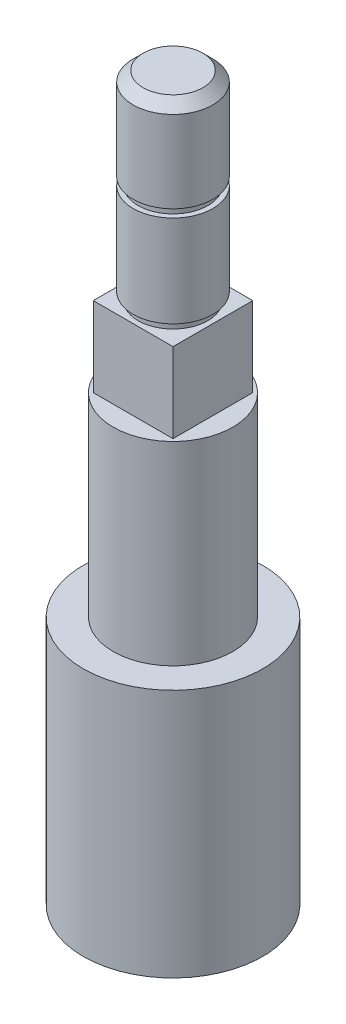
ISO-10303-21;
HEADER;
FILE_DESCRIPTION(('STEP AP214'),'2;1');
FILE_NAME('part.step','',(''),(''),'','','');
FILE_SCHEMA(('AUTOMOTIVE_DESIGN { 1 0 10303 214 1 1 1 1 }'));
ENDSEC;
DATA;
#1=APPLICATION_CONTEXT('core data for automotive mechanical design processes');
#2=APPLICATION_PROTOCOL_DEFINITION('international standard','automotive_design',2000,#1);
#3=PRODUCT_CONTEXT('',#1,'mechanical');
#4=PRODUCT('Part','Part','',(#3));
#5=PRODUCT_RELATED_PRODUCT_CATEGORY('part','',(#4));
#6=PRODUCT_DEFINITION_FORMATION('','',#4);
#7=PRODUCT_DEFINITION_CONTEXT('part definition',#1,'design');
#8=PRODUCT_DEFINITION('design','',#6,#7);
#9=PRODUCT_DEFINITION_SHAPE('','',#8);
#10=(LENGTH_UNIT() NAMED_UNIT(*) SI_UNIT(.MILLI.,.METRE.));
#11=(NAMED_UNIT(*) PLANE_ANGLE_UNIT() SI_UNIT($,.RADIAN.));
#12=(NAMED_UNIT(*) SI_UNIT($,.STERADIAN.) SOLID_ANGLE_UNIT());
#13=UNCERTAINTY_MEASURE_WITH_UNIT(LENGTH_MEASURE(1.E-05),#10,'distance_accuracy_value','');
#14=(GEOMETRIC_REPRESENTATION_CONTEXT(3) GLOBAL_UNCERTAINTY_ASSIGNED_CONTEXT((#13)) GLOBAL_UNIT_ASSIGNED_CONTEXT((#10,
#11,#12)) REPRESENTATION_CONTEXT('',''));
#15=CARTESIAN_POINT('',(0.,0.,0.));
#16=DIRECTION('',(0.,0.,1.));
#17=DIRECTION('',(1.,0.,0.));
#18=AXIS2_PLACEMENT_3D('',#15,#16,#17);
#19=CARTESIAN_POINT('',(0.,25.,0.));
#20=DIRECTION('',(0.,-1.,0.));
#21=DIRECTION('',(0.,0.,-1.));
#22=AXIS2_PLACEMENT_3D('',#19,#20,#21);
#23=CYLINDRICAL_SURFACE('',#22,9.);
#24=CARTESIAN_POINT('',(-9.,8.5,0.));
#25=CARTESIAN_POINT('',(-8.99999856701294,8.50000335336869,-0.0836345429749289));
#26=CARTESIAN_POINT('',(-8.9988220674782,8.50701836498135,-0.167314729103293));
#27=CARTESIAN_POINT('',(-8.99424206964832,8.53488139525919,-0.332328133003826));
#28=CARTESIAN_POINT('',(-8.99083652354334,8.55574213414696,-0.413659120775548));
#29=CARTESIAN_POINT('',(-8.9821804094187,8.61064926915565,-0.571562848327586));
#30=CARTESIAN_POINT('',(-8.97693135095516,8.64468487938434,-0.64813942105914));
#31=CARTESIAN_POINT('',(-8.96516536249242,8.72494737523144,-0.794485105186767));
#32=CARTESIAN_POINT('',(-8.9586485775266,8.7711728664898,-0.864254993927155));
#33=CARTESIAN_POINT('',(-8.94499990474988,8.87497305029228,-0.995683568575008));
#34=CARTESIAN_POINT('',(-8.93786323088914,8.93264146878168,-1.05726774212098));
#35=CARTESIAN_POINT('',(-8.92381576126039,9.05748878108369,-1.16993309919596));
#36=CARTESIAN_POINT('',(-8.916904979776,9.12466827487397,-1.22101361963458));
#37=CARTESIAN_POINT('',(-8.90404539455868,9.26714257971823,-1.31152027536308));
#38=CARTESIAN_POINT('',(-8.89810277454982,9.34248480208285,-1.3508727317166));
#39=CARTESIAN_POINT('',(-8.88791873876805,9.49882573858037,-1.41633501924673));
#40=CARTESIAN_POINT('',(-8.88367720808584,9.57982407020658,-1.44244574493937));
#41=CARTESIAN_POINT('',(-8.87742322105653,9.74438816491392,-1.48044862667088));
#42=CARTESIAN_POINT('',(-8.8753906109142,9.82792344190083,-1.49246941748124));
#43=CARTESIAN_POINT('',(-8.87372363361989,9.99584816613008,-1.50235003517393));
#44=CARTESIAN_POINT('',(-8.87408909674328,10.0802375525004,-1.5002108642334));
#45=CARTESIAN_POINT('',(-8.87715857318133,10.2465567167653,-1.48193705903769));
#46=CARTESIAN_POINT('',(-8.8798384399135,10.3285028821271,-1.46594692913386));
#47=CARTESIAN_POINT('',(-8.88719697126605,10.4885327906975,-1.42065188424207));
#48=CARTESIAN_POINT('',(-8.89187570443963,10.5666164013331,-1.39134651259184));
#49=CARTESIAN_POINT('',(-8.9027308760046,10.7171372940646,-1.32010634765635));
#50=CARTESIAN_POINT('',(-8.90891440264395,10.7895456436487,-1.27811154832783));
#51=CARTESIAN_POINT('',(-8.92207751049005,10.926342640323,-1.18272721053446));
#52=CARTESIAN_POINT('',(-8.92905715592572,10.990730639473,-1.12933675239257));
#53=CARTESIAN_POINT('',(-8.94313216727871,11.1104956514844,-1.01188932729543));
#54=CARTESIAN_POINT('',(-8.95022789538991,11.165751111124,-0.947708378323877));
#55=CARTESIAN_POINT('',(-8.96365560838034,11.2647266575992,-0.810921149388988));
#56=CARTESIAN_POINT('',(-8.96998758833847,11.3084466701099,-0.738314815143853));
#57=CARTESIAN_POINT('',(-8.98118335735747,11.3831213362818,-0.586623549700027));
#58=CARTESIAN_POINT('',(-8.98604591044468,11.4140652515988,-0.507533235338797));
#59=CARTESIAN_POINT('',(-8.99374501807596,11.4621965291476,-0.345179007361639));
#60=CARTESIAN_POINT('',(-8.99658174210284,11.4793850421842,-0.261915443507681));
#61=CARTESIAN_POINT('',(-8.99988677905612,11.4993528150767,-0.0946259407809745));
#62=CARTESIAN_POINT('',(-9.00038251807671,11.5022989430834,-0.0106204422906072));
#63=CARTESIAN_POINT('',(-8.99902484652702,11.4941431933431,0.156683863733932));
#64=CARTESIAN_POINT('',(-8.99717152634471,11.4830418561198,0.239982698335222));
#65=CARTESIAN_POINT('',(-8.99134096162921,11.4472450903987,0.402993705328057));
#66=CARTESIAN_POINT('',(-8.98737662880786,11.4226322749659,0.482724521031227));
#67=CARTESIAN_POINT('',(-8.97776678673215,11.3605992890803,0.636928130916264));
#68=CARTESIAN_POINT('',(-8.97212118307212,11.3231783994188,0.71140062954583));
#69=CARTESIAN_POINT('',(-8.95970709781445,11.2362093251819,0.853698413681374));
#70=CARTESIAN_POINT('',(-8.95292913532213,11.1865569062996,0.921459150562288));
#71=CARTESIAN_POINT('',(-8.9390308043514,11.076677610769,1.04774615130161));
#72=CARTESIAN_POINT('',(-8.93191041102928,11.016449966034,1.10627174381795));
#73=CARTESIAN_POINT('',(-8.91804105141507,10.8863814711571,1.2130456677948));
#74=CARTESIAN_POINT('',(-8.91129669682264,10.8164475006914,1.26118125666823));
#75=CARTESIAN_POINT('',(-8.8990291786673,10.6693882185169,1.34502138617699));
#76=CARTESIAN_POINT('',(-8.89350597639612,10.5922631348635,1.38072632086189));
#77=CARTESIAN_POINT('',(-8.88434072218623,10.4333261603127,1.43852299888389));
#78=CARTESIAN_POINT('',(-8.88069092586639,10.3515351429817,1.46067085952877));
#79=CARTESIAN_POINT('',(-8.87566630101156,10.1853279224669,1.49090127226697));
#80=CARTESIAN_POINT('',(-8.87429127469633,10.1009119481608,1.4989850471677));
#81=CARTESIAN_POINT('',(-8.87398039850407,9.93297690042256,1.50082371962841));
#82=CARTESIAN_POINT('',(-8.8750143390339,9.84945977285483,1.49475608167511));
#83=CARTESIAN_POINT('',(-8.87933868872237,9.68465245116954,1.46884790337411));
#84=CARTESIAN_POINT('',(-8.88262909056728,9.60336224983488,1.44900740766749));
#85=CARTESIAN_POINT('',(-8.89108413769031,9.44538493762443,1.39618469375694));
#86=CARTESIAN_POINT('',(-8.89624660331802,9.36869259396639,1.36321775436027));
#87=CARTESIAN_POINT('',(-8.90786621353324,9.22189859848309,1.28509620234955));
#88=CARTESIAN_POINT('',(-8.91432342233039,9.15179727377672,1.23994098524914));
#89=CARTESIAN_POINT('',(-8.92790072427373,9.01927865013535,1.13809133062329));
#90=CARTESIAN_POINT('',(-8.93502777345781,8.95696238997984,1.08126633815619));
#91=CARTESIAN_POINT('',(-8.94908623416505,8.84268903731504,0.95796541882814));
#92=CARTESIAN_POINT('',(-8.95601760015928,8.7907343388171,0.891487267747583));
#93=CARTESIAN_POINT('',(-8.96895917785332,8.69833103908003,0.750221501784171));
#94=CARTESIAN_POINT('',(-8.97496269751862,8.65796437641223,0.675379672519693));
#95=CARTESIAN_POINT('',(-8.98530700561065,8.59043830923405,0.519907841627391));
#96=CARTESIAN_POINT('',(-8.98964944906489,8.56326575135218,0.439283696898007));
#97=CARTESIAN_POINT('',(-8.99523474499773,8.528796835524,0.298621986027241));
#98=CARTESIAN_POINT('',(-8.99701216364015,8.51801531823042,0.239435298179069));
#99=CARTESIAN_POINT('',(-8.99939529591672,8.50361575729315,0.120173586191886));
#100=CARTESIAN_POINT('',(-9.00000102972385,8.49999759031758,0.0600985773650968));
#101=CARTESIAN_POINT('',(-9.,8.5,0.));
#102=B_SPLINE_CURVE_WITH_KNOTS('',3,(#24,#25,#26,#27,#28,#29,#30,#31,#32,#33,#34,#35,#36,#37,
#38,#39,#40,#41,#42,#43,#44,#45,#46,#47,#48,#49,#50,#51,#52,#53,#54,#55,#56,#57,#58,#59,#60,#61,
#62,#63,#64,#65,#66,#67,#68,#69,#70,#71,#72,#73,#74,#75,#76,#77,#78,#79,#80,#81,#82,#83,#84,#85,
#86,#87,#88,#89,#90,#91,#92,#93,#94,#95,#96,#97,#98,#99,#100,#101),.UNSPECIFIED.,.T.,.F.,(4,2,2,
2,2,2,2,2,2,2,2,2,2,2,2,2,2,2,2,2,2,2,2,2,2,2,2,2,2,2,2,2,2,2,2,2,2,2,4),(0.,0.250683950963106,
0.501598527417252,0.752308120215162,1.00298904760487,1.25581494637399,1.50865680101914,
1.76305512494304,2.01743626125709,2.26947646262054,2.52149882592532,2.77092313056245,
3.02035599015229,3.27098733979534,3.52163892408344,3.77539661946796,4.02915594981509,
4.28312813349542,4.53707906712689,4.78804730094838,5.03900587821516,5.28844684203849,
5.5379018149564,5.78956095376214,6.0412383783257,6.29552293204572,6.54979942425566,
6.80301613405063,7.05621082671971,7.3062474571362,7.5562832771288,7.80602890935733,
8.05578693017602,8.30850830516035,8.56128800327383,8.81581338964319,9.07008451278043,
9.25022548898411,9.4303633636618),.UNSPECIFIED.);
#103=CARTESIAN_POINT('',(-9.,8.5,0.));
#104=VERTEX_POINT('',#103);
#105=EDGE_CURVE('E129',#104,#104,#102,.T.);
#106=ORIENTED_EDGE('',*,*,#105,.T.);
#107=EDGE_LOOP('',(#106));
#108=FACE_BOUND('',#107,.T.);
#109=CARTESIAN_POINT('',(0.,25.,0.));
#110=DIRECTION('',(0.,1.,0.));
#111=DIRECTION('',(0.,0.,1.));
#112=AXIS2_PLACEMENT_3D('',#109,#110,#111);
#113=CIRCLE('',#112,9.);
#114=CARTESIAN_POINT('',(0.,25.,9.));
#115=VERTEX_POINT('',#114);
#116=EDGE_CURVE('E111',#115,#115,#113,.T.);
#117=ORIENTED_EDGE('',*,*,#116,.F.);
#118=EDGE_LOOP('',(#117));
#119=FACE_BOUND('',#118,.T.);
#120=CARTESIAN_POINT('',(0.,0.,0.));
#121=DIRECTION('',(0.,1.,0.));
#122=DIRECTION('',(0.,0.,1.));
#123=AXIS2_PLACEMENT_3D('',#120,#121,#122);
#124=CIRCLE('',#123,9.);
#125=CARTESIAN_POINT('',(0.,0.,9.));
#126=VERTEX_POINT('',#125);
#127=EDGE_CURVE('E115',#126,#126,#124,.T.);
#128=ORIENTED_EDGE('',*,*,#127,.T.);
#129=EDGE_LOOP('',(#128));
#130=FACE_BOUND('',#129,.T.);
#131=ADVANCED_FACE('F36',(#108,#119,#130),#23,.T.);
#132=CARTESIAN_POINT('',(0.,25.,0.));
#133=DIRECTION('',(0.,1.,0.));
#134=DIRECTION('',(0.,0.,1.));
#135=AXIS2_PLACEMENT_3D('',#132,#133,#134);
#136=PLANE('',#135);
#137=CARTESIAN_POINT('',(0.,25.,0.));
#138=DIRECTION('',(0.,1.,0.));
#139=DIRECTION('',(0.,0.,1.));
#140=AXIS2_PLACEMENT_3D('',#137,#138,#139);
#141=CIRCLE('',#140,6.);
#142=CARTESIAN_POINT('',(0.,25.,6.));
#143=VERTEX_POINT('',#142);
#144=EDGE_CURVE('E108',#143,#143,#141,.T.);
#145=ORIENTED_EDGE('',*,*,#144,.F.);
#146=EDGE_LOOP('',(#145));
#147=FACE_BOUND('',#146,.T.);
#148=ORIENTED_EDGE('',*,*,#116,.T.);
#149=EDGE_LOOP('',(#148));
#150=FACE_BOUND('',#149,.T.);
#151=ADVANCED_FACE('F157',(#147,#150),#136,.T.);
#152=CARTESIAN_POINT('',(0.,0.,0.));
#153=DIRECTION('',(0.,1.,0.));
#154=DIRECTION('',(0.,0.,1.));
#155=AXIS2_PLACEMENT_3D('',#152,#153,#154);
#156=PLANE('',#155);
#157=CARTESIAN_POINT('',(0.,0.,0.));
#158=DIRECTION('',(0.,-1.,0.));
#159=DIRECTION('',(0.,0.,-1.));
#160=AXIS2_PLACEMENT_3D('',#157,#158,#159);
#161=CIRCLE('',#160,4.);
#162=CARTESIAN_POINT('',(0.,0.,-4.));
#163=VERTEX_POINT('',#162);
#164=EDGE_CURVE('E102',#163,#163,#161,.T.);
#165=ORIENTED_EDGE('',*,*,#164,.F.);
#166=EDGE_LOOP('',(#165));
#167=FACE_BOUND('',#166,.T.);
#168=ORIENTED_EDGE('',*,*,#127,.F.);
#169=EDGE_LOOP('',(#168));
#170=FACE_BOUND('',#169,.T.);
#171=ADVANCED_FACE('F159',(#167,#170),#156,.F.);
#172=CARTESIAN_POINT('',(0.,20.,0.));
#173=DIRECTION('',(0.,-1.,0.));
#174=DIRECTION('',(0.,0.,-1.));
#175=AXIS2_PLACEMENT_3D('',#172,#173,#174);
#176=CYLINDRICAL_SURFACE('',#175,4.);
#177=CARTESIAN_POINT('',(-3.70809924354783,10.,-1.5));
#178=CARTESIAN_POINT('',(-3.70809640633806,9.91899251627921,-1.50000304106109));
#179=CARTESIAN_POINT('',(-3.71078260240986,9.83800507749637,-1.49341597549487));
#180=CARTESIAN_POINT('',(-3.72116159304967,9.6784719170868,-1.46736187895468));
#181=CARTESIAN_POINT('',(-3.72885423767112,9.59992612240499,-1.44789523373263));
#182=CARTESIAN_POINT('',(-3.748254802809,9.44762462838647,-1.39689657610574));
#183=CARTESIAN_POINT('',(-3.7599530956926,9.37385794334892,-1.36539347266348));
#184=CARTESIAN_POINT('',(-3.78603134206598,9.23262810318116,-1.29131856742698));
#185=CARTESIAN_POINT('',(-3.80041210067323,9.16516684971748,-1.24874344095039));
#186=CARTESIAN_POINT('',(-3.83103574665713,9.03510968837718,-1.15146661374162));
#187=CARTESIAN_POINT('',(-3.84733341923603,8.97287147037061,-1.09630381213306));
#188=CARTESIAN_POINT('',(-3.87949750628547,8.85827718532851,-0.976395839778927));
#189=CARTESIAN_POINT('',(-3.89536382814785,8.80592322625815,-0.91164863025668));
#190=CARTESIAN_POINT('',(-3.92552873936553,8.71086048770439,-0.7716946551776));
#191=CARTESIAN_POINT('',(-3.93975561223505,8.66854052528414,-0.696206947538028));
#192=CARTESIAN_POINT('',(-3.96438007973848,8.59734882747509,-0.538555771965248));
#193=CARTESIAN_POINT('',(-3.97477900217006,8.56847242800803,-0.456394630933536));
#194=CARTESIAN_POINT('',(-3.9901869710344,8.52624210422538,-0.291489341676832));
#195=CARTESIAN_POINT('',(-3.99540915214774,8.51227237255954,-0.208923197281597));
#196=CARTESIAN_POINT('',(-4.0006401410794,8.49827879905501,-0.0424643637947862));
#197=CARTESIAN_POINT('',(-4.00065064414902,8.49825042238129,0.0414278850628328));
#198=CARTESIAN_POINT('',(-3.99559265903894,8.51178176146517,0.203743543064476));
#199=CARTESIAN_POINT('',(-3.99077541996683,8.52466929794882,0.2822321782669));
#200=CARTESIAN_POINT('',(-3.97693274932263,8.56253591522555,0.435839217984392));
#201=CARTESIAN_POINT('',(-3.96790701975578,8.58751585226204,0.510957383430299));
#202=CARTESIAN_POINT('',(-3.94637769167531,8.64917045167585,0.656989017303104));
#203=CARTESIAN_POINT('',(-3.93382539470077,8.68601000526841,0.727825392287309));
#204=CARTESIAN_POINT('',(-3.90651310225279,8.77019209692939,0.862486607957559));
#205=CARTESIAN_POINT('',(-3.8917523951284,8.8175380230176,0.926309176932323));
#206=CARTESIAN_POINT('',(-3.86052529655816,8.92462728628318,1.04909048680094));
#207=CARTESIAN_POINT('',(-3.84400963763883,8.98493391565043,1.10754614526348));
#208=CARTESIAN_POINT('',(-3.81182460645722,9.11459299332156,1.21370395569342));
#209=CARTESIAN_POINT('',(-3.79615544748847,9.18394770658664,1.261403406929));
#210=CARTESIAN_POINT('',(-3.76712703500335,9.33171946746282,1.34565611808152));
#211=CARTESIAN_POINT('',(-3.75382677150277,9.41030349368607,1.38193847851831));
#212=CARTESIAN_POINT('',(-3.73172438629002,9.57309622516757,1.44056464441501));
#213=CARTESIAN_POINT('',(-3.72291976205783,9.65730177159369,1.46291620605595));
#214=CARTESIAN_POINT('',(-3.71139597222848,9.82397596231595,1.49190191709668));
#215=CARTESIAN_POINT('',(-3.70836785241537,9.90628410553614,1.49933521158966));
#216=CARTESIAN_POINT('',(-3.70786539525016,10.0710093567417,1.50057885636272));
#217=CARTESIAN_POINT('',(-3.71038967003987,10.1534264323525,1.49439261093762));
#218=CARTESIAN_POINT('',(-3.72039381629735,10.3119299222877,1.46929733520157));
#219=CARTESIAN_POINT('',(-3.72763276216449,10.3881311357647,1.45100618334225));
#220=CARTESIAN_POINT('',(-3.74596487046361,10.5363479447202,1.40299774640638));
#221=CARTESIAN_POINT('',(-3.75705882250173,10.6083626791681,1.37327812034623));
#222=CARTESIAN_POINT('',(-3.7823624311608,10.7491644380762,1.30200292275278));
#223=CARTESIAN_POINT('',(-3.79667328892065,10.8177292921373,1.26004545177047));
#224=CARTESIAN_POINT('',(-3.82662814294291,10.947128981726,1.16591317862479));
#225=CARTESIAN_POINT('',(-3.84227262594077,11.0079609746246,1.11373463696435));
#226=CARTESIAN_POINT('',(-3.87433046553184,11.1241683731951,0.996727340900938));
#227=CARTESIAN_POINT('',(-3.89072969357028,11.1789534087688,0.931306341491061));
#228=CARTESIAN_POINT('',(-3.92149874963302,11.2768383675894,0.79179747175315));
#229=CARTESIAN_POINT('',(-3.93586857107664,11.3199382529458,0.717709573322673));
#230=CARTESIAN_POINT('',(-3.96094985704552,11.3929460561996,0.563016329468477));
#231=CARTESIAN_POINT('',(-3.9716738133801,11.4228991237926,0.482434433064627));
#232=CARTESIAN_POINT('',(-3.98829436712571,11.4686564138499,0.316881887523255));
#233=CARTESIAN_POINT('',(-3.99419323299412,11.4844672854224,0.231913320723593));
#234=CARTESIAN_POINT('',(-4.00028407317073,11.5007744027548,0.0653355852738158));
#235=CARTESIAN_POINT('',(-4.00078860953764,11.502109483059,-0.0161807680608449));
#236=CARTESIAN_POINT('',(-3.99684889809224,11.4915848405546,-0.178226786412423));
#237=CARTESIAN_POINT('',(-3.9924052471313,11.4797267091141,-0.258756569245257));
#238=CARTESIAN_POINT('',(-3.97921089603771,11.4437411485064,-0.414548248377126));
#239=CARTESIAN_POINT('',(-3.97056791378017,11.4199200941216,-0.489890731068835));
#240=CARTESIAN_POINT('',(-3.9498778362099,11.3609899866156,-0.635515473006391));
#241=CARTESIAN_POINT('',(-3.93783009655664,11.3258787966952,-0.705796771275543));
#242=CARTESIAN_POINT('',(-3.91090618300074,11.2436860564952,-0.842540176994413));
#243=CARTESIAN_POINT('',(-3.89593240108828,11.1961633594859,-0.90871754884685));
#244=CARTESIAN_POINT('',(-3.86499507694844,11.0911921698124,-1.03241734752336));
#245=CARTESIAN_POINT('',(-3.84903118274027,11.0337401341921,-1.0899366712559));
#246=CARTESIAN_POINT('',(-3.81688129739175,10.9069358683549,-1.19781214236196));
#247=CARTESIAN_POINT('',(-3.8007280534916,10.8371155978457,-1.24762999816025));
#248=CARTESIAN_POINT('',(-3.77098325003638,10.6895841304267,-1.33484709556843));
#249=CARTESIAN_POINT('',(-3.75739195631216,10.6118721159465,-1.37224504878157));
#250=CARTESIAN_POINT('',(-3.73402269853266,10.4470443190246,-1.4346588697426));
#251=CARTESIAN_POINT('',(-3.7244380329086,10.3596656334882,-1.45906002899523));
#252=CARTESIAN_POINT('',(-3.71147994336315,10.1815147280442,-1.49172356722079));
#253=CARTESIAN_POINT('',(-3.70810242179736,10.09074478729,-1.49999659339571));
#254=CARTESIAN_POINT('',(-3.70809924354783,10.,-1.5));
#255=B_SPLINE_CURVE_WITH_KNOTS('',3,(#177,#178,#179,#180,#181,#182,#183,#184,#185,#186,#187,
#188,#189,#190,#191,#192,#193,#194,#195,#196,#197,#198,#199,#200,#201,#202,#203,#204,#205,#206,
#207,#208,#209,#210,#211,#212,#213,#214,#215,#216,#217,#218,#219,#220,#221,#222,#223,#224,#225,
#226,#227,#228,#229,#230,#231,#232,#233,#234,#235,#236,#237,#238,#239,#240,#241,#242,#243,#244,
#245,#246,#247,#248,#249,#250,#251,#252,#253,#254),.UNSPECIFIED.,.T.,.F.,(4,2,2,2,2,2,2,2,2,2,2,
2,2,2,2,2,2,2,2,2,2,2,2,2,2,2,2,2,2,2,2,2,2,2,2,2,2,2,4),(0.,0.242684541416169,
0.485361814598854,0.72745985675703,0.969630679682932,1.22274652401128,1.47591628822983,
1.73770072136421,1.9993942638133,2.24980018489679,2.50012465404857,2.73806472803194,
2.97602165263335,3.21744131210668,3.45893893628976,3.71456675065874,3.97025867827335,
4.23162592252967,4.49284751635474,4.73965657740485,4.98640395388884,5.22143845928198,
5.45652113429526,5.70041561005821,5.94439948466355,6.20385016993624,6.46330169650178,
6.72185508890168,6.98028685560127,7.22365720549936,7.4669982031948,7.7044027400389,
7.94185223512831,8.18928323676987,8.43680270894965,8.69738599542079,8.95799630544242,
9.23003178870927,9.50188762323053),.UNSPECIFIED.);
#256=CARTESIAN_POINT('',(-3.70809924354783,10.,-1.5));
#257=VERTEX_POINT('',#256);
#258=EDGE_CURVE('E122',#257,#257,#255,.T.);
#259=ORIENTED_EDGE('',*,*,#258,.T.);
#260=EDGE_LOOP('',(#259));
#261=FACE_BOUND('',#260,.T.);
#262=CARTESIAN_POINT('',(0.,20.,0.));
#263=DIRECTION('',(0.,-1.,0.));
#264=DIRECTION('',(0.,0.,-1.));
#265=AXIS2_PLACEMENT_3D('',#262,#263,#264);
#266=CIRCLE('',#265,4.);
#267=CARTESIAN_POINT('',(0.,20.,-4.));
#268=VERTEX_POINT('',#267);
#269=EDGE_CURVE('E112',#268,#268,#266,.T.);
#270=ORIENTED_EDGE('',*,*,#269,.F.);
#271=EDGE_LOOP('',(#270));
#272=FACE_BOUND('',#271,.T.);
#273=ORIENTED_EDGE('',*,*,#164,.T.);
#274=EDGE_LOOP('',(#273));
#275=FACE_BOUND('',#274,.T.);
#276=ADVANCED_FACE('F131',(#261,#272,#275),#176,.F.);
#277=CARTESIAN_POINT('',(0.,20.,0.));
#278=DIRECTION('',(0.,-1.,0.));
#279=DIRECTION('',(0.,0.,-1.));
#280=AXIS2_PLACEMENT_3D('',#277,#278,#279);
#281=PLANE('',#280);
#282=ORIENTED_EDGE('',*,*,#269,.T.);
#283=EDGE_LOOP('',(#282));
#284=FACE_BOUND('',#283,.T.);
#285=ADVANCED_FACE('F177',(#284),#281,.T.);
#286=CARTESIAN_POINT('',(0.,44.5,0.));
#287=DIRECTION('',(0.,-1.,0.));
#288=DIRECTION('',(0.,0.,-1.));
#289=AXIS2_PLACEMENT_3D('',#286,#287,#288);
#290=CYLINDRICAL_SURFACE('',#289,6.);
#291=CARTESIAN_POINT('',(0.,44.5,0.));
#292=DIRECTION('',(0.,1.,0.));
#293=DIRECTION('',(0.,0.,1.));
#294=AXIS2_PLACEMENT_3D('',#291,#292,#293);
#295=CIRCLE('',#294,6.);
#296=CARTESIAN_POINT('',(0.,44.5,6.));
#297=VERTEX_POINT('',#296);
#298=EDGE_CURVE('E99',#297,#297,#295,.T.);
#299=ORIENTED_EDGE('',*,*,#298,.F.);
#300=EDGE_LOOP('',(#299));
#301=FACE_BOUND('',#300,.T.);
#302=ORIENTED_EDGE('',*,*,#144,.T.);
#303=EDGE_LOOP('',(#302));
#304=FACE_BOUND('',#303,.T.);
#305=ADVANCED_FACE('F174',(#301,#304),#290,.T.);
#306=CARTESIAN_POINT('',(0.,44.5,0.));
#307=DIRECTION('',(0.,1.,0.));
#308=DIRECTION('',(0.,0.,1.));
#309=AXIS2_PLACEMENT_3D('',#306,#307,#308);
#310=PLANE('',#309);
#311=DIRECTION('',(0.,0.,1.));
#312=VECTOR('',#311,1.);
#313=CARTESIAN_POINT('',(-4.,44.5,-4.));
#314=LINE('',#313,#312);
#315=CARTESIAN_POINT('',(-4.,44.5,-4.));
#316=VERTEX_POINT('',#315);
#317=CARTESIAN_POINT('',(-4.,44.5,4.));
#318=VERTEX_POINT('',#317);
#319=EDGE_CURVE('E52',#316,#318,#314,.T.);
#320=ORIENTED_EDGE('',*,*,#319,.F.);
#321=DIRECTION('',(-1.,0.,0.));
#322=VECTOR('',#321,1.);
#323=CARTESIAN_POINT('',(-4.,44.5,-4.));
#324=LINE('',#323,#322);
#325=CARTESIAN_POINT('',(4.,44.5,-4.));
#326=VERTEX_POINT('',#325);
#327=EDGE_CURVE('E56',#326,#316,#324,.T.);
#328=ORIENTED_EDGE('',*,*,#327,.F.);
#329=DIRECTION('',(0.,0.,-1.));
#330=VECTOR('',#329,1.);
#331=CARTESIAN_POINT('',(4.,44.5,-4.));
#332=LINE('',#331,#330);
#333=CARTESIAN_POINT('',(4.,44.5,4.));
#334=VERTEX_POINT('',#333);
#335=EDGE_CURVE('E406',#334,#326,#332,.T.);
#336=ORIENTED_EDGE('',*,*,#335,.F.);
#337=DIRECTION('',(1.,0.,0.));
#338=VECTOR('',#337,1.);
#339=CARTESIAN_POINT('',(-4.,44.5,4.));
#340=LINE('',#339,#338);
#341=EDGE_CURVE('E412',#318,#334,#340,.T.);
#342=ORIENTED_EDGE('',*,*,#341,.F.);
#343=EDGE_LOOP('',(#320,#328,#336,#342));
#344=FACE_BOUND('',#343,.T.);
#345=ORIENTED_EDGE('',*,*,#298,.T.);
#346=EDGE_LOOP('',(#345));
#347=FACE_BOUND('',#346,.T.);
#348=ADVANCED_FACE('F176',(#344,#347),#310,.T.);
#349=CARTESIAN_POINT('',(-4.,52.5,-4.));
#350=DIRECTION('',(1.,0.,0.));
#351=DIRECTION('',(0.,0.,-1.));
#352=AXIS2_PLACEMENT_3D('',#349,#350,#351);
#353=PLANE('',#352);
#354=ORIENTED_EDGE('',*,*,#319,.T.);
#355=DIRECTION('',(0.,-1.,0.));
#356=VECTOR('',#355,1.);
#357=CARTESIAN_POINT('',(-4.,52.5,4.));
#358=LINE('',#357,#356);
#359=CARTESIAN_POINT('',(-4.,52.5,4.));
#360=VERTEX_POINT('',#359);
#361=EDGE_CURVE('E92',#360,#318,#358,.T.);
#362=ORIENTED_EDGE('',*,*,#361,.F.);
#363=DIRECTION('',(0.,0.,1.));
#364=VECTOR('',#363,1.);
#365=CARTESIAN_POINT('',(-4.,52.5,-4.));
#366=LINE('',#365,#364);
#367=CARTESIAN_POINT('',(-4.,52.5,-4.));
#368=VERTEX_POINT('',#367);
#369=EDGE_CURVE('E75',#368,#360,#366,.T.);
#370=ORIENTED_EDGE('',*,*,#369,.F.);
#371=DIRECTION('',(0.,-1.,0.));
#372=VECTOR('',#371,1.);
#373=CARTESIAN_POINT('',(-4.,52.5,-4.));
#374=LINE('',#373,#372);
#375=EDGE_CURVE('E404',#368,#316,#374,.T.);
#376=ORIENTED_EDGE('',*,*,#375,.T.);
#377=EDGE_LOOP('',(#354,#362,#370,#376));
#378=FACE_BOUND('',#377,.T.);
#379=ADVANCED_FACE('F98',(#378),#353,.F.);
#380=CARTESIAN_POINT('',(-4.,52.5,4.));
#381=DIRECTION('',(0.,0.,-1.));
#382=DIRECTION('',(-1.,0.,0.));
#383=AXIS2_PLACEMENT_3D('',#380,#381,#382);
#384=PLANE('',#383);
#385=ORIENTED_EDGE('',*,*,#341,.T.);
#386=DIRECTION('',(0.,-1.,0.));
#387=VECTOR('',#386,1.);
#388=CARTESIAN_POINT('',(4.,52.5,4.));
#389=LINE('',#388,#387);
#390=CARTESIAN_POINT('',(4.,52.5,4.));
#391=VERTEX_POINT('',#390);
#392=EDGE_CURVE('E94',#391,#334,#389,.T.);
#393=ORIENTED_EDGE('',*,*,#392,.F.);
#394=DIRECTION('',(1.,0.,0.));
#395=VECTOR('',#394,1.);
#396=CARTESIAN_POINT('',(-4.,52.5,4.));
#397=LINE('',#396,#395);
#398=EDGE_CURVE('E79',#360,#391,#397,.T.);
#399=ORIENTED_EDGE('',*,*,#398,.F.);
#400=ORIENTED_EDGE('',*,*,#361,.T.);
#401=EDGE_LOOP('',(#385,#393,#399,#400));
#402=FACE_BOUND('',#401,.T.);
#403=ADVANCED_FACE('F91',(#402),#384,.F.);
#404=CARTESIAN_POINT('',(4.,52.5,-4.));
#405=DIRECTION('',(-1.,0.,0.));
#406=DIRECTION('',(0.,0.,1.));
#407=AXIS2_PLACEMENT_3D('',#404,#405,#406);
#408=PLANE('',#407);
#409=ORIENTED_EDGE('',*,*,#335,.T.);
#410=DIRECTION('',(0.,-1.,0.));
#411=VECTOR('',#410,1.);
#412=CARTESIAN_POINT('',(4.,52.5,-4.));
#413=LINE('',#412,#411);
#414=CARTESIAN_POINT('',(4.,52.5,-4.));
#415=VERTEX_POINT('',#414);
#416=EDGE_CURVE('E104',#415,#326,#413,.T.);
#417=ORIENTED_EDGE('',*,*,#416,.F.);
#418=DIRECTION('',(0.,0.,-1.));
#419=VECTOR('',#418,1.);
#420=CARTESIAN_POINT('',(4.,52.5,-4.));
#421=LINE('',#420,#419);
#422=EDGE_CURVE('E96',#391,#415,#421,.T.);
#423=ORIENTED_EDGE('',*,*,#422,.F.);
#424=ORIENTED_EDGE('',*,*,#392,.T.);
#425=EDGE_LOOP('',(#409,#417,#423,#424));
#426=FACE_BOUND('',#425,.T.);
#427=ADVANCED_FACE('F192',(#426),#408,.F.);
#428=CARTESIAN_POINT('',(-4.,52.5,-4.));
#429=DIRECTION('',(0.,0.,1.));
#430=DIRECTION('',(1.,0.,0.));
#431=AXIS2_PLACEMENT_3D('',#428,#429,#430);
#432=PLANE('',#431);
#433=ORIENTED_EDGE('',*,*,#327,.T.);
#434=ORIENTED_EDGE('',*,*,#375,.F.);
#435=DIRECTION('',(-1.,0.,0.));
#436=VECTOR('',#435,1.);
#437=CARTESIAN_POINT('',(-4.,52.5,-4.));
#438=LINE('',#437,#436);
#439=EDGE_CURVE('E82',#415,#368,#438,.T.);
#440=ORIENTED_EDGE('',*,*,#439,.F.);
#441=ORIENTED_EDGE('',*,*,#416,.T.);
#442=EDGE_LOOP('',(#433,#434,#440,#441));
#443=FACE_BOUND('',#442,.T.);
#444=ADVANCED_FACE('F195',(#443),#432,.F.);
#445=CARTESIAN_POINT('',(0.,52.5,0.));
#446=DIRECTION('',(0.,1.,0.));
#447=DIRECTION('',(0.,0.,1.));
#448=AXIS2_PLACEMENT_3D('',#445,#446,#447);
#449=PLANE('',#448);
#450=ORIENTED_EDGE('',*,*,#398,.T.);
#451=ORIENTED_EDGE('',*,*,#422,.T.);
#452=ORIENTED_EDGE('',*,*,#439,.T.);
#453=ORIENTED_EDGE('',*,*,#369,.T.);
#454=EDGE_LOOP('',(#450,#451,#452,#453));
#455=FACE_BOUND('',#454,.T.);
#456=CARTESIAN_POINT('',(0.,52.5,0.));
#457=DIRECTION('',(0.,1.,0.));
#458=DIRECTION('',(0.,0.,1.));
#459=AXIS2_PLACEMENT_3D('',#456,#457,#458);
#460=CIRCLE('',#459,3.5);
#461=CARTESIAN_POINT('',(0.,52.5,3.5));
#462=VERTEX_POINT('',#461);
#463=EDGE_CURVE('E240',#462,#462,#460,.T.);
#464=ORIENTED_EDGE('',*,*,#463,.F.);
#465=EDGE_LOOP('',(#464));
#466=FACE_BOUND('',#465,.T.);
#467=ADVANCED_FACE('F77',(#455,#466),#449,.T.);
#468=CARTESIAN_POINT('',(-9.,10.,0.));
#469=DIRECTION('',(1.,0.,0.));
#470=DIRECTION('',(0.,0.,-1.));
#471=AXIS2_PLACEMENT_3D('',#468,#469,#470);
#472=CYLINDRICAL_SURFACE('',#471,1.5);
#473=ORIENTED_EDGE('',*,*,#258,.F.);
#474=EDGE_LOOP('',(#473));
#475=FACE_BOUND('',#474,.T.);
#476=ORIENTED_EDGE('',*,*,#105,.F.);
#477=EDGE_LOOP('',(#476));
#478=FACE_BOUND('',#477,.T.);
#479=ADVANCED_FACE('F135',(#475,#478),#472,.F.);
#480=CARTESIAN_POINT('',(0.,53.3,-4.));
#481=DIRECTION('',(0.,-1.,0.));
#482=DIRECTION('',(0.,0.,-1.));
#483=AXIS2_PLACEMENT_3D('',#480,#481,#482);
#484=PLANE('',#483);
#485=CARTESIAN_POINT('',(0.,53.3,0.));
#486=DIRECTION('',(0.,1.,0.));
#487=DIRECTION('',(0.,0.,1.));
#488=AXIS2_PLACEMENT_3D('',#485,#486,#487);
#489=CIRCLE('',#488,3.5);
#490=CARTESIAN_POINT('',(0.,53.3,3.5));
#491=VERTEX_POINT('',#490);
#492=EDGE_CURVE('E234',#491,#491,#489,.T.);
#493=ORIENTED_EDGE('',*,*,#492,.T.);
#494=EDGE_LOOP('',(#493));
#495=FACE_BOUND('',#494,.T.);
#496=CARTESIAN_POINT('',(0.,53.3,0.));
#497=DIRECTION('',(0.,1.,0.));
#498=DIRECTION('',(0.,0.,1.));
#499=AXIS2_PLACEMENT_3D('',#496,#497,#498);
#500=CIRCLE('',#499,4.);
#501=CARTESIAN_POINT('',(0.,53.3,4.));
#502=VERTEX_POINT('',#501);
#503=EDGE_CURVE('E152',#502,#502,#500,.T.);
#504=ORIENTED_EDGE('',*,*,#503,.F.);
#505=EDGE_LOOP('',(#504));
#506=FACE_BOUND('',#505,.T.);
#507=ADVANCED_FACE('F140',(#495,#506),#484,.T.);
#508=CARTESIAN_POINT('',(0.,72.5,0.));
#509=DIRECTION('',(0.,1.,0.));
#510=DIRECTION('',(0.,0.,1.));
#511=AXIS2_PLACEMENT_3D('',#508,#509,#510);
#512=CYLINDRICAL_SURFACE('',#511,3.5);
#513=ORIENTED_EDGE('',*,*,#463,.T.);
#514=EDGE_LOOP('',(#513));
#515=FACE_BOUND('',#514,.T.);
#516=ORIENTED_EDGE('',*,*,#492,.F.);
#517=EDGE_LOOP('',(#516));
#518=FACE_BOUND('',#517,.T.);
#519=ADVANCED_FACE('F204',(#515,#518),#512,.T.);
#520=CARTESIAN_POINT('',(0.,72.5,0.));
#521=DIRECTION('',(0.,-1.,0.));
#522=DIRECTION('',(0.,0.,-1.));
#523=AXIS2_PLACEMENT_3D('',#520,#521,#522);
#524=CYLINDRICAL_SURFACE('',#523,4.);
#525=ORIENTED_EDGE('',*,*,#503,.T.);
#526=EDGE_LOOP('',(#525));
#527=FACE_BOUND('',#526,.T.);
#528=CARTESIAN_POINT('',(0.,62.5,0.));
#529=DIRECTION('',(0.,1.,0.));
#530=DIRECTION('',(0.,0.,1.));
#531=AXIS2_PLACEMENT_3D('',#528,#529,#530);
#532=CIRCLE('',#531,4.);
#533=CARTESIAN_POINT('',(0.,62.5,4.));
#534=VERTEX_POINT('',#533);
#535=EDGE_CURVE('E130',#534,#534,#532,.T.);
#536=ORIENTED_EDGE('',*,*,#535,.F.);
#537=EDGE_LOOP('',(#536));
#538=FACE_BOUND('',#537,.T.);
#539=ADVANCED_FACE('F201',(#527,#538),#524,.T.);
#540=CARTESIAN_POINT('',(0.,62.5,-4.));
#541=DIRECTION('',(0.,1.,0.));
#542=DIRECTION('',(0.,0.,1.));
#543=AXIS2_PLACEMENT_3D('',#540,#541,#542);
#544=PLANE('',#543);
#545=ORIENTED_EDGE('',*,*,#535,.T.);
#546=EDGE_LOOP('',(#545));
#547=FACE_BOUND('',#546,.T.);
#548=CARTESIAN_POINT('',(0.,62.5,0.));
#549=DIRECTION('',(0.,1.,0.));
#550=DIRECTION('',(0.,0.,1.));
#551=AXIS2_PLACEMENT_3D('',#548,#549,#550);
#552=CIRCLE('',#551,3.5);
#553=CARTESIAN_POINT('',(0.,62.5,3.5));
#554=VERTEX_POINT('',#553);
#555=EDGE_CURVE('E232',#554,#554,#552,.T.);
#556=ORIENTED_EDGE('',*,*,#555,.F.);
#557=EDGE_LOOP('',(#556));
#558=FACE_BOUND('',#557,.T.);
#559=ADVANCED_FACE('F203',(#547,#558),#544,.T.);
#560=CARTESIAN_POINT('',(0.,72.5,0.));
#561=DIRECTION('',(0.,1.,0.));
#562=DIRECTION('',(0.,0.,1.));
#563=AXIS2_PLACEMENT_3D('',#560,#561,#562);
#564=CYLINDRICAL_SURFACE('',#563,3.5);
#565=ORIENTED_EDGE('',*,*,#555,.T.);
#566=EDGE_LOOP('',(#565));
#567=FACE_BOUND('',#566,.T.);
#568=CARTESIAN_POINT('',(0.,63.3,0.));
#569=DIRECTION('',(0.,1.,0.));
#570=DIRECTION('',(0.,0.,1.));
#571=AXIS2_PLACEMENT_3D('',#568,#569,#570);
#572=CIRCLE('',#571,3.5);
#573=CARTESIAN_POINT('',(0.,63.3,3.5));
#574=VERTEX_POINT('',#573);
#575=EDGE_CURVE('E229',#574,#574,#572,.T.);
#576=ORIENTED_EDGE('',*,*,#575,.F.);
#577=EDGE_LOOP('',(#576));
#578=FACE_BOUND('',#577,.T.);
#579=ADVANCED_FACE('F211',(#567,#578),#564,.T.);
#580=CARTESIAN_POINT('',(0.,63.3,-3.99999999999999));
#581=DIRECTION('',(0.,-1.,0.));
#582=DIRECTION('',(0.,0.,-1.));
#583=AXIS2_PLACEMENT_3D('',#580,#581,#582);
#584=PLANE('',#583);
#585=ORIENTED_EDGE('',*,*,#575,.T.);
#586=EDGE_LOOP('',(#585));
#587=FACE_BOUND('',#586,.T.);
#588=CARTESIAN_POINT('',(0.,63.3,0.));
#589=DIRECTION('',(0.,1.,0.));
#590=DIRECTION('',(0.,0.,1.));
#591=AXIS2_PLACEMENT_3D('',#588,#589,#590);
#592=CIRCLE('',#591,3.99999999999999);
#593=CARTESIAN_POINT('',(0.,63.3,3.99999999999999));
#594=VERTEX_POINT('',#593);
#595=EDGE_CURVE('E227',#594,#594,#592,.T.);
#596=ORIENTED_EDGE('',*,*,#595,.F.);
#597=EDGE_LOOP('',(#596));
#598=FACE_BOUND('',#597,.T.);
#599=ADVANCED_FACE('F279',(#587,#598),#584,.T.);
#600=CARTESIAN_POINT('',(0.,72.5,0.));
#601=DIRECTION('',(0.,1.,0.));
#602=DIRECTION('',(0.,0.,1.));
#603=AXIS2_PLACEMENT_3D('',#600,#601,#602);
#604=PLANE('',#603);
#605=CARTESIAN_POINT('',(0.,72.5,0.));
#606=DIRECTION('',(0.,1.,0.));
#607=DIRECTION('',(0.,0.,1.));
#608=AXIS2_PLACEMENT_3D('',#605,#606,#607);
#609=CIRCLE('',#608,3.);
#610=CARTESIAN_POINT('',(0.,72.5,3.));
#611=VERTEX_POINT('',#610);
#612=EDGE_CURVE('E45',#611,#611,#609,.T.);
#613=ORIENTED_EDGE('',*,*,#612,.T.);
#614=EDGE_LOOP('',(#613));
#615=FACE_BOUND('',#614,.T.);
#616=ADVANCED_FACE('F143',(#615),#604,.T.);
#617=CARTESIAN_POINT('',(0.,72.5,0.));
#618=DIRECTION('',(0.,-1.,0.));
#619=DIRECTION('',(0.,0.,-1.));
#620=AXIS2_PLACEMENT_3D('',#617,#618,#619);
#621=CONICAL_SURFACE('',#620,3.,0.785398163397443);
#622=CARTESIAN_POINT('',(0.,71.5,0.));
#623=DIRECTION('',(0.,1.,0.));
#624=DIRECTION('',(0.,0.,1.));
#625=AXIS2_PLACEMENT_3D('',#622,#623,#624);
#626=CIRCLE('',#625,4.);
#627=CARTESIAN_POINT('',(0.,71.5,4.));
#628=VERTEX_POINT('',#627);
#629=EDGE_CURVE('E11',#628,#628,#626,.F.);
#630=ORIENTED_EDGE('',*,*,#629,.F.);
#631=EDGE_LOOP('',(#630));
#632=FACE_BOUND('',#631,.T.);
#633=ORIENTED_EDGE('',*,*,#612,.F.);
#634=EDGE_LOOP('',(#633));
#635=FACE_BOUND('',#634,.T.);
#636=ADVANCED_FACE('F39',(#632,#635),#621,.T.);
#637=ORIENTED_EDGE('',*,*,#629,.T.);
#638=EDGE_LOOP('',(#637));
#639=FACE_BOUND('',#638,.T.);
#640=ORIENTED_EDGE('',*,*,#595,.T.);
#641=EDGE_LOOP('',(#640));
#642=FACE_BOUND('',#641,.T.);
#643=ADVANCED_FACE('F206',(#639,#642),#524,.T.);
#644=CLOSED_SHELL('',(#131,#151,#171,#276,#285,#305,#348,#379,#403,#427,#444,#467,#479,#507,
#519,#539,#559,#579,#599,#616,#636,#643));
#645=MANIFOLD_SOLID_BREP('B2',#644);
#646=ADVANCED_BREP_SHAPE_REPRESENTATION('',(#18,#645),#14);
#647=SHAPE_DEFINITION_REPRESENTATION(#9,#646);
ENDSEC;
END-ISO-10303-21;
